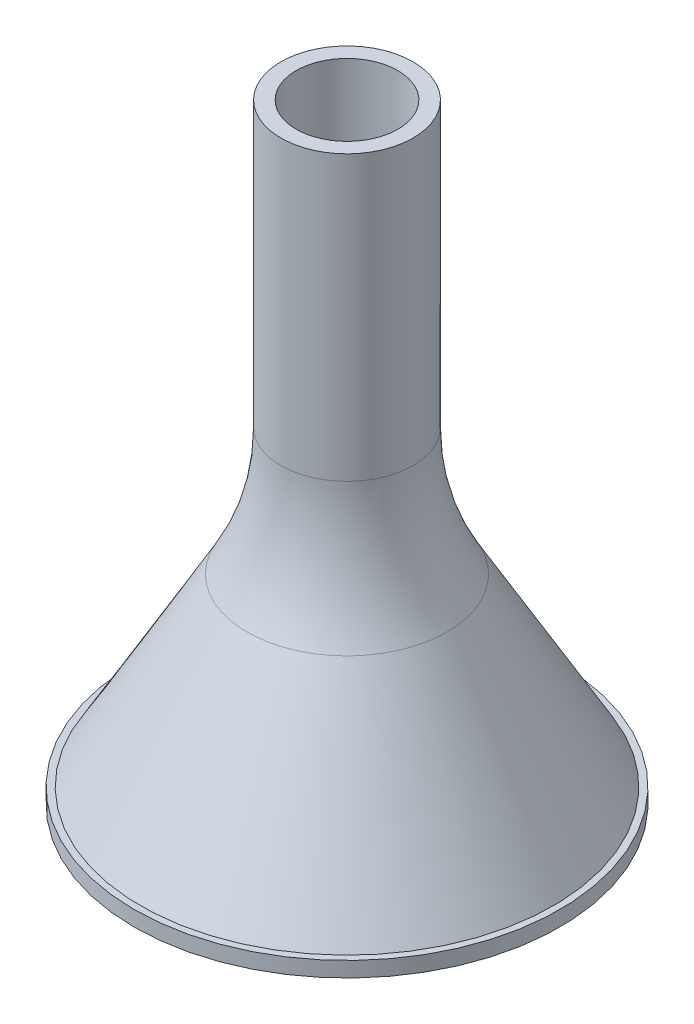
ISO-10303-21;
HEADER;
FILE_DESCRIPTION(('STEP AP214'),'2;1');
FILE_NAME('part.step','',(''),(''),'','','');
FILE_SCHEMA(('AUTOMOTIVE_DESIGN { 1 0 10303 214 1 1 1 1 }'));
ENDSEC;
DATA;
#1=APPLICATION_CONTEXT('core data for automotive mechanical design processes');
#2=APPLICATION_PROTOCOL_DEFINITION('international standard','automotive_design',2000,#1);
#3=PRODUCT_CONTEXT('',#1,'mechanical');
#4=PRODUCT('Part','Part','',(#3));
#5=PRODUCT_RELATED_PRODUCT_CATEGORY('part','',(#4));
#6=PRODUCT_DEFINITION_FORMATION('','',#4);
#7=PRODUCT_DEFINITION_CONTEXT('part definition',#1,'design');
#8=PRODUCT_DEFINITION('design','',#6,#7);
#9=PRODUCT_DEFINITION_SHAPE('','',#8);
#10=(LENGTH_UNIT() NAMED_UNIT(*) SI_UNIT(.MILLI.,.METRE.));
#11=(NAMED_UNIT(*) PLANE_ANGLE_UNIT() SI_UNIT($,.RADIAN.));
#12=(NAMED_UNIT(*) SI_UNIT($,.STERADIAN.) SOLID_ANGLE_UNIT());
#13=UNCERTAINTY_MEASURE_WITH_UNIT(LENGTH_MEASURE(1.E-05),#10,'distance_accuracy_value','');
#14=(GEOMETRIC_REPRESENTATION_CONTEXT(3) GLOBAL_UNCERTAINTY_ASSIGNED_CONTEXT((#13)) GLOBAL_UNIT_ASSIGNED_CONTEXT((#10,
#11,#12)) REPRESENTATION_CONTEXT('',''));
#15=CARTESIAN_POINT('',(0.,0.,0.));
#16=DIRECTION('',(0.,0.,1.));
#17=DIRECTION('',(1.,0.,0.));
#18=AXIS2_PLACEMENT_3D('',#15,#16,#17);
#19=CARTESIAN_POINT('',(38.8675134594812,0.,0.));
#20=DIRECTION('',(0.,-1.,0.));
#21=DIRECTION('',(0.,0.,-1.));
#22=AXIS2_PLACEMENT_3D('',#19,#20,#21);
#23=PLANE('',#22);
#24=CARTESIAN_POINT('',(0.,0.,0.));
#25=DIRECTION('',(0.,-1.,0.));
#26=DIRECTION('',(0.,0.,-1.));
#27=AXIS2_PLACEMENT_3D('',#24,#25,#26);
#28=CIRCLE('',#27,41.8675134594812);
#29=CARTESIAN_POINT('',(0.,0.,-41.8675134594812));
#30=VERTEX_POINT('',#29);
#31=EDGE_CURVE('E67',#30,#30,#28,.T.);
#32=ORIENTED_EDGE('',*,*,#31,.T.);
#33=EDGE_LOOP('',(#32));
#34=FACE_BOUND('',#33,.T.);
#35=CARTESIAN_POINT('',(0.,0.,0.));
#36=DIRECTION('',(0.,-1.,0.));
#37=DIRECTION('',(0.,0.,-1.));
#38=AXIS2_PLACEMENT_3D('',#35,#36,#37);
#39=CIRCLE('',#38,38.8675134594812);
#40=CARTESIAN_POINT('',(0.,0.,-38.8675134594812));
#41=VERTEX_POINT('',#40);
#42=EDGE_CURVE('E47',#41,#41,#39,.T.);
#43=ORIENTED_EDGE('',*,*,#42,.F.);
#44=EDGE_LOOP('',(#43));
#45=FACE_BOUND('',#44,.T.);
#46=ADVANCED_FACE('F32',(#34,#45),#23,.T.);
#47=CARTESIAN_POINT('',(0.,50.,0.));
#48=DIRECTION('',(0.,-1.,0.));
#49=DIRECTION('',(0.,0.,-1.));
#50=AXIS2_PLACEMENT_3D('',#47,#48,#49);
#51=CONICAL_SURFACE('',#50,10.,0.523598775598297);
#52=CARTESIAN_POINT('',(0.,50.,0.));
#53=DIRECTION('',(0.,-1.,0.));
#54=DIRECTION('',(0.,0.,-1.));
#55=AXIS2_PLACEMENT_3D('',#52,#53,#54);
#56=CIRCLE('',#55,10.);
#57=CARTESIAN_POINT('',(0.,50.,-10.));
#58=VERTEX_POINT('',#57);
#59=EDGE_CURVE('E52',#58,#58,#56,.T.);
#60=CARTESIAN_POINT('',(0.,0.,-38.8675134594812));
#61=CARTESIAN_POINT('',(0.,0.520833333333333,-38.5668101942782));
#62=CARTESIAN_POINT('',(0.,1.04166666666667,-38.2661069290753));
#63=CARTESIAN_POINT('',(0.,2.08333333333334,-37.6647003986694));
#64=CARTESIAN_POINT('',(0.,2.60416666666667,-37.3639971334665));
#65=CARTESIAN_POINT('',(0.,3.64583333333333,-36.7625906030607));
#66=CARTESIAN_POINT('',(0.,4.16666666666667,-36.4618873378577));
#67=CARTESIAN_POINT('',(0.,5.20833333333333,-35.8604808074519));
#68=CARTESIAN_POINT('',(0.,5.72916666666666,-35.5597775422489));
#69=CARTESIAN_POINT('',(0.,6.77083333333333,-34.9583710118431));
#70=CARTESIAN_POINT('',(0.,7.29166666666667,-34.6576677466402));
#71=CARTESIAN_POINT('',(0.,8.33333333333333,-34.0562612162343));
#72=CARTESIAN_POINT('',(0.,8.85416666666667,-33.7555579510314));
#73=CARTESIAN_POINT('',(0.,9.89583333333334,-33.1541514206255));
#74=CARTESIAN_POINT('',(0.,10.4166666666667,-32.8534481554226));
#75=CARTESIAN_POINT('',(0.,11.4583333333333,-32.2520416250167));
#76=CARTESIAN_POINT('',(0.,11.9791666666667,-31.9513383598138));
#77=CARTESIAN_POINT('',(0.,13.0208333333333,-31.3499318294079));
#78=CARTESIAN_POINT('',(0.,13.5416666666667,-31.049228564205));
#79=CARTESIAN_POINT('',(0.,14.5833333333333,-30.4478220337992));
#80=CARTESIAN_POINT('',(0.,15.1041666666667,-30.1471187685962));
#81=CARTESIAN_POINT('',(0.,16.1458333333333,-29.5457122381904));
#82=CARTESIAN_POINT('',(0.,16.6666666666667,-29.2450089729874));
#83=CARTESIAN_POINT('',(0.,17.7083333333333,-28.6436024425816));
#84=CARTESIAN_POINT('',(0.,18.2291666666667,-28.3428991773787));
#85=CARTESIAN_POINT('',(0.,19.2708333333333,-27.7414926469728));
#86=CARTESIAN_POINT('',(0.,19.7916666666667,-27.4407893817699));
#87=CARTESIAN_POINT('',(0.,20.8333333333333,-26.839382851364));
#88=CARTESIAN_POINT('',(0.,21.3541666666667,-26.5386795861611));
#89=CARTESIAN_POINT('',(0.,22.3958333333333,-25.9372730557552));
#90=CARTESIAN_POINT('',(0.,22.9166666666667,-25.6365697905523));
#91=CARTESIAN_POINT('',(0.,23.9583333333333,-25.0351632601464));
#92=CARTESIAN_POINT('',(0.,24.4791666666667,-24.7344599949435));
#93=CARTESIAN_POINT('',(0.,25.5208333333333,-24.1330534645377));
#94=CARTESIAN_POINT('',(0.,26.0416666666667,-23.8323501993347));
#95=CARTESIAN_POINT('',(0.,27.0833333333333,-23.2309436689289));
#96=CARTESIAN_POINT('',(0.,27.6041666666667,-22.9302404037259));
#97=CARTESIAN_POINT('',(0.,28.6458333333333,-22.3288338733201));
#98=CARTESIAN_POINT('',(0.,29.1666666666667,-22.0281306081172));
#99=CARTESIAN_POINT('',(0.,30.2083333333333,-21.4267240777113));
#100=CARTESIAN_POINT('',(0.,30.7291666666667,-21.1260208125084));
#101=CARTESIAN_POINT('',(0.,31.7708333333333,-20.5246142821025));
#102=CARTESIAN_POINT('',(0.,32.2916666666667,-20.2239110168996));
#103=CARTESIAN_POINT('',(0.,33.3333333333333,-19.6225044864937));
#104=CARTESIAN_POINT('',(0.,33.8541666666667,-19.3218012212908));
#105=CARTESIAN_POINT('',(0.,34.8958333333333,-18.7203946908849));
#106=CARTESIAN_POINT('',(0.,35.4166666666667,-18.419691425682));
#107=CARTESIAN_POINT('',(0.,36.4583333333333,-17.8182848952762));
#108=CARTESIAN_POINT('',(0.,36.9791666666667,-17.5175816300732));
#109=CARTESIAN_POINT('',(0.,38.0208333333333,-16.9161750996674));
#110=CARTESIAN_POINT('',(0.,38.5416666666667,-16.6154718344644));
#111=CARTESIAN_POINT('',(0.,39.5833333333333,-16.0140653040586));
#112=CARTESIAN_POINT('',(0.,40.1041666666667,-15.7133620388557));
#113=CARTESIAN_POINT('',(0.,41.1458333333333,-15.1119555084498));
#114=CARTESIAN_POINT('',(0.,41.6666666666667,-14.8112522432469));
#115=CARTESIAN_POINT('',(0.,42.7083333333333,-14.209845712841));
#116=CARTESIAN_POINT('',(0.,43.2291666666667,-13.9091424476381));
#117=CARTESIAN_POINT('',(0.,44.2708333333333,-13.3077359172322));
#118=CARTESIAN_POINT('',(0.,44.7916666666667,-13.0070326520293));
#119=CARTESIAN_POINT('',(0.,45.8333333333333,-12.4056261216234));
#120=CARTESIAN_POINT('',(0.,46.3541666666667,-12.1049228564205));
#121=CARTESIAN_POINT('',(0.,47.3958333333333,-11.5035163260147));
#122=CARTESIAN_POINT('',(0.,47.9166666666667,-11.2028130608117));
#123=CARTESIAN_POINT('',(0.,48.9583333333333,-10.6014065304059));
#124=CARTESIAN_POINT('',(0.,49.4791666666667,-10.3007032652029));
#125=CARTESIAN_POINT('',(0.,50.,-10.));
#126=B_SPLINE_CURVE_WITH_KNOTS('',3,(#60,#61,#62,#63,#64,#65,#66,#67,#68,#69,#70,#71,#72,#73,
#74,#75,#76,#77,#78,#79,#80,#81,#82,#83,#84,#85,#86,#87,#88,#89,#90,#91,#92,#93,#94,#95,#96,#97,
#98,#99,#100,#101,#102,#103,#104,#105,#106,#107,#108,#109,#110,#111,#112,#113,#114,#115,#116,
#117,#118,#119,#120,#121,#122,#123,#124,#125),.UNSPECIFIED.,.F.,.F.,(4,2,2,2,2,2,2,2,2,2,2,2,2,
2,2,2,2,2,2,2,2,2,2,2,2,2,2,2,2,2,2,2,4),(0.,1.80421959121758,3.60843918243516,5.41265877365273,
7.21687836487031,9.02109795608789,10.8253175473055,12.6295371385231,14.4337567297406,
16.2379763209582,18.0421959121758,19.8464155033934,21.6506350946109,23.4548546858285,
25.2590742770461,27.0632938682637,28.8675134594813,30.6717330506988,32.4759526419164,
34.280172233134,36.0843918243516,37.8886114155691,39.6928310067867,41.4970505980043,
43.3012701892219,45.1054897804394,46.909709371657,48.7139289628746,50.5181485540922,
52.3223681453098,54.1265877365273,55.9308073277449,57.7350269189625),.UNSPECIFIED.);
#127=EDGE_CURVE('BSEAM97',#41,#58,#126,.T.);
#128=ORIENTED_EDGE('',*,*,#42,.T.);
#129=ORIENTED_EDGE('',*,*,#59,.F.);
#130=ORIENTED_EDGE('',*,*,#127,.T.);
#131=ORIENTED_EDGE('',*,*,#127,.F.);
#132=EDGE_LOOP('',(#128,#130,#129,#131));
#133=FACE_BOUND('',#132,.T.);
#134=ADVANCED_FACE('F97',(#133),#51,.F.);
#135=CARTESIAN_POINT('',(0.,0.,0.));
#136=DIRECTION('',(0.,-1.,0.));
#137=DIRECTION('',(0.,0.,-1.));
#138=AXIS2_PLACEMENT_3D('',#135,#136,#137);
#139=CYLINDRICAL_SURFACE('',#138,10.);
#140=CARTESIAN_POINT('',(0.,55.,0.));
#141=DIRECTION('',(0.,1.,0.));
#142=DIRECTION('',(0.,0.,1.));
#143=AXIS2_PLACEMENT_3D('',#140,#141,#142);
#144=CIRCLE('',#143,10.);
#145=CARTESIAN_POINT('',(0.,55.,10.));
#146=VERTEX_POINT('',#145);
#147=EDGE_CURVE('E43',#146,#146,#144,.T.);
#148=ORIENTED_EDGE('',*,*,#147,.F.);
#149=EDGE_LOOP('',(#148));
#150=FACE_BOUND('',#149,.T.);
#151=CARTESIAN_POINT('',(0.,120.,0.));
#152=DIRECTION('',(0.,-1.,0.));
#153=DIRECTION('',(0.,0.,-1.));
#154=AXIS2_PLACEMENT_3D('',#151,#152,#153);
#155=CIRCLE('',#154,10.);
#156=CARTESIAN_POINT('',(0.,120.,-10.));
#157=VERTEX_POINT('',#156);
#158=EDGE_CURVE('E55',#157,#157,#155,.T.);
#159=ORIENTED_EDGE('',*,*,#158,.F.);
#160=EDGE_LOOP('',(#159));
#161=FACE_BOUND('',#160,.T.);
#162=ADVANCED_FACE('F102',(#150,#161),#139,.F.);
#163=CARTESIAN_POINT('',(10.,120.,0.));
#164=DIRECTION('',(0.,-1.,0.));
#165=DIRECTION('',(0.,0.,-1.));
#166=AXIS2_PLACEMENT_3D('',#163,#164,#165);
#167=PLANE('',#166);
#168=CARTESIAN_POINT('',(0.,120.,0.));
#169=DIRECTION('',(0.,-1.,0.));
#170=DIRECTION('',(0.,0.,-1.));
#171=AXIS2_PLACEMENT_3D('',#168,#169,#170);
#172=CIRCLE('',#171,13.);
#173=CARTESIAN_POINT('',(0.,120.,-13.));
#174=VERTEX_POINT('',#173);
#175=EDGE_CURVE('E58',#174,#174,#172,.T.);
#176=ORIENTED_EDGE('',*,*,#175,.F.);
#177=EDGE_LOOP('',(#176));
#178=FACE_BOUND('',#177,.T.);
#179=ORIENTED_EDGE('',*,*,#158,.T.);
#180=EDGE_LOOP('',(#179));
#181=FACE_BOUND('',#180,.T.);
#182=ADVANCED_FACE('F109',(#178,#181),#167,.F.);
#183=CARTESIAN_POINT('',(0.,0.,0.));
#184=DIRECTION('',(0.,-1.,0.));
#185=DIRECTION('',(0.,0.,-1.));
#186=AXIS2_PLACEMENT_3D('',#183,#184,#185);
#187=CYLINDRICAL_SURFACE('',#186,13.);
#188=CARTESIAN_POINT('',(0.,64.2013071988495,0.));
#189=DIRECTION('',(0.,-1.,0.));
#190=DIRECTION('',(0.,0.,-1.));
#191=AXIS2_PLACEMENT_3D('',#188,#189,#190);
#192=CIRCLE('',#191,13.);
#193=CARTESIAN_POINT('',(0.,64.2013071988495,-13.));
#194=VERTEX_POINT('',#193);
#195=EDGE_CURVE('E10',#194,#194,#192,.F.);
#196=ORIENTED_EDGE('',*,*,#195,.T.);
#197=EDGE_LOOP('',(#196));
#198=FACE_BOUND('',#197,.T.);
#199=ORIENTED_EDGE('',*,*,#175,.T.);
#200=EDGE_LOOP('',(#199));
#201=FACE_BOUND('',#200,.T.);
#202=ADVANCED_FACE('F113',(#198,#201),#187,.T.);
#203=CARTESIAN_POINT('',(0.,50.8038475772934,0.));
#204=DIRECTION('',(0.,-1.,0.));
#205=DIRECTION('',(0.,0.,-1.));
#206=AXIS2_PLACEMENT_3D('',#203,#204,#205);
#207=CONICAL_SURFACE('',#206,13.,0.523598775598297);
#208=CARTESIAN_POINT('',(0.,39.2013071988496,0.));
#209=DIRECTION('',(0.,-1.,0.));
#210=DIRECTION('',(0.,0.,-1.));
#211=AXIS2_PLACEMENT_3D('',#208,#209,#210);
#212=CIRCLE('',#211,19.698729810778);
#213=CARTESIAN_POINT('',(0.,39.2013071988496,-19.698729810778));
#214=VERTEX_POINT('',#213);
#215=EDGE_CURVE('E39',#214,#214,#212,.T.);
#216=ORIENTED_EDGE('',*,*,#215,.T.);
#217=EDGE_LOOP('',(#216));
#218=FACE_BOUND('',#217,.T.);
#219=CARTESIAN_POINT('',(0.,3.,0.));
#220=DIRECTION('',(0.,-1.,0.));
#221=DIRECTION('',(0.,0.,-1.));
#222=AXIS2_PLACEMENT_3D('',#219,#220,#221);
#223=CIRCLE('',#222,40.59956426705);
#224=CARTESIAN_POINT('',(0.,3.,-40.59956426705));
#225=VERTEX_POINT('',#224);
#226=EDGE_CURVE('E61',#225,#225,#223,.T.);
#227=ORIENTED_EDGE('',*,*,#226,.F.);
#228=EDGE_LOOP('',(#227));
#229=FACE_BOUND('',#228,.T.);
#230=ADVANCED_FACE('F117',(#218,#229),#207,.T.);
#231=CARTESIAN_POINT('',(38.8675134594812,3.,0.));
#232=DIRECTION('',(0.,-1.,0.));
#233=DIRECTION('',(0.,0.,-1.));
#234=AXIS2_PLACEMENT_3D('',#231,#232,#233);
#235=PLANE('',#234);
#236=CARTESIAN_POINT('',(0.,3.,0.));
#237=DIRECTION('',(0.,-1.,0.));
#238=DIRECTION('',(0.,0.,-1.));
#239=AXIS2_PLACEMENT_3D('',#236,#237,#238);
#240=CIRCLE('',#239,41.8675134594812);
#241=CARTESIAN_POINT('',(0.,3.,-41.8675134594812));
#242=VERTEX_POINT('',#241);
#243=EDGE_CURVE('E64',#242,#242,#240,.T.);
#244=ORIENTED_EDGE('',*,*,#243,.F.);
#245=EDGE_LOOP('',(#244));
#246=FACE_BOUND('',#245,.T.);
#247=ORIENTED_EDGE('',*,*,#226,.T.);
#248=EDGE_LOOP('',(#247));
#249=FACE_BOUND('',#248,.T.);
#250=ADVANCED_FACE('F92',(#246,#249),#235,.F.);
#251=CARTESIAN_POINT('',(0.,0.,0.));
#252=DIRECTION('',(0.,-1.,0.));
#253=DIRECTION('',(0.,0.,-1.));
#254=AXIS2_PLACEMENT_3D('',#251,#252,#253);
#255=CYLINDRICAL_SURFACE('',#254,41.8675134594812);
#256=ORIENTED_EDGE('',*,*,#31,.F.);
#257=EDGE_LOOP('',(#256));
#258=FACE_BOUND('',#257,.T.);
#259=ORIENTED_EDGE('',*,*,#243,.T.);
#260=EDGE_LOOP('',(#259));
#261=FACE_BOUND('',#260,.T.);
#262=ADVANCED_FACE('F83',(#258,#261),#255,.T.);
#263=CARTESIAN_POINT('',(0.,55.,0.));
#264=DIRECTION('',(0.,1.,0.));
#265=DIRECTION('',(0.,0.,1.));
#266=AXIS2_PLACEMENT_3D('',#263,#264,#265);
#267=PLANE('',#266);
#268=ORIENTED_EDGE('',*,*,#147,.T.);
#269=EDGE_LOOP('',(#268));
#270=FACE_BOUND('',#269,.T.);
#271=CARTESIAN_POINT('',(0.,55.,0.));
#272=DIRECTION('',(0.,1.,0.));
#273=DIRECTION('',(0.,0.,1.));
#274=AXIS2_PLACEMENT_3D('',#271,#272,#273);
#275=CIRCLE('',#274,4.);
#276=CARTESIAN_POINT('',(0.,55.,4.));
#277=VERTEX_POINT('',#276);
#278=EDGE_CURVE('E70',#277,#277,#275,.T.);
#279=ORIENTED_EDGE('',*,*,#278,.F.);
#280=EDGE_LOOP('',(#279));
#281=FACE_BOUND('',#280,.T.);
#282=ADVANCED_FACE('F80',(#270,#281),#267,.T.);
#283=CARTESIAN_POINT('',(0.,50.,0.));
#284=DIRECTION('',(0.,1.,0.));
#285=DIRECTION('',(0.,0.,1.));
#286=AXIS2_PLACEMENT_3D('',#283,#284,#285);
#287=PLANE('',#286);
#288=ORIENTED_EDGE('',*,*,#59,.T.);
#289=EDGE_LOOP('',(#288));
#290=FACE_BOUND('',#289,.T.);
#291=CARTESIAN_POINT('',(0.,50.,0.));
#292=DIRECTION('',(0.,1.,0.));
#293=DIRECTION('',(0.,0.,1.));
#294=AXIS2_PLACEMENT_3D('',#291,#292,#293);
#295=CIRCLE('',#294,4.);
#296=CARTESIAN_POINT('',(0.,50.,4.));
#297=VERTEX_POINT('',#296);
#298=EDGE_CURVE('E71',#297,#297,#295,.T.);
#299=ORIENTED_EDGE('',*,*,#298,.T.);
#300=EDGE_LOOP('',(#299));
#301=FACE_BOUND('',#300,.T.);
#302=ADVANCED_FACE('F82',(#290,#301),#287,.F.);
#303=CARTESIAN_POINT('',(0.,55.,0.));
#304=DIRECTION('',(0.,-1.,0.));
#305=DIRECTION('',(0.,0.,-1.));
#306=AXIS2_PLACEMENT_3D('',#303,#304,#305);
#307=CYLINDRICAL_SURFACE('',#306,4.);
#308=ORIENTED_EDGE('',*,*,#278,.T.);
#309=EDGE_LOOP('',(#308));
#310=FACE_BOUND('',#309,.T.);
#311=ORIENTED_EDGE('',*,*,#298,.F.);
#312=EDGE_LOOP('',(#311));
#313=FACE_BOUND('',#312,.T.);
#314=ADVANCED_FACE('F77',(#310,#313),#307,.F.);
#315=CARTESIAN_POINT('',(0.,64.2013071988495,0.));
#316=DIRECTION('',(0.,-1.,0.));
#317=DIRECTION('',(0.,0.,-1.));
#318=AXIS2_PLACEMENT_3D('',#315,#316,#317);
#319=TOROIDAL_SURFACE('',#318,63.,50.);
#320=ORIENTED_EDGE('',*,*,#195,.F.);
#321=EDGE_LOOP('',(#320));
#322=FACE_BOUND('',#321,.T.);
#323=ORIENTED_EDGE('',*,*,#215,.F.);
#324=EDGE_LOOP('',(#323));
#325=FACE_BOUND('',#324,.T.);
#326=ADVANCED_FACE('F34',(#322,#325),#319,.F.);
#327=CLOSED_SHELL('',(#46,#134,#162,#182,#202,#230,#250,#262,#282,#302,#314,#326));
#328=MANIFOLD_SOLID_BREP('B2',#327);
#329=ADVANCED_BREP_SHAPE_REPRESENTATION('',(#18,#328),#14);
#330=SHAPE_DEFINITION_REPRESENTATION(#9,#329);
ENDSEC;
END-ISO-10303-21;
